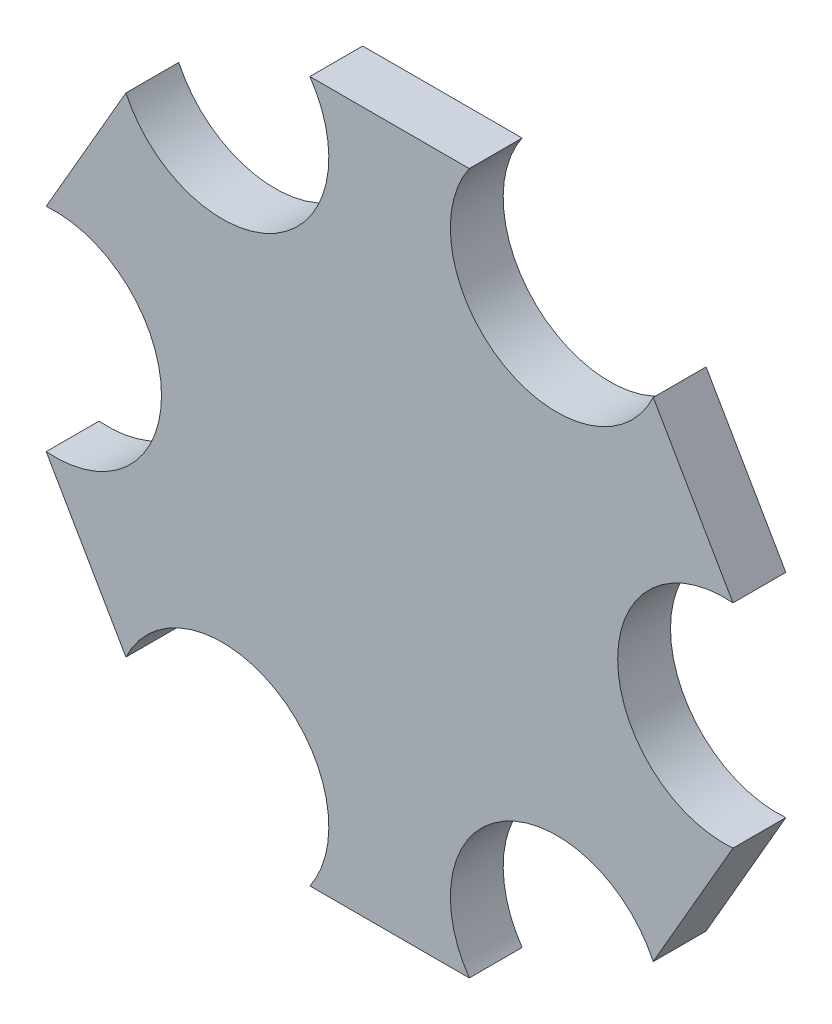
ISO-10303-21;
HEADER;
FILE_DESCRIPTION(('STEP AP214'),'2;1');
FILE_NAME('part.step','',(''),(''),'','','');
FILE_SCHEMA(('AUTOMOTIVE_DESIGN { 1 0 10303 214 1 1 1 1 }'));
ENDSEC;
DATA;
#1=APPLICATION_CONTEXT('core data for automotive mechanical design processes');
#2=APPLICATION_PROTOCOL_DEFINITION('international standard','automotive_design',2000,#1);
#3=PRODUCT_CONTEXT('',#1,'mechanical');
#4=PRODUCT('Part','Part','',(#3));
#5=PRODUCT_RELATED_PRODUCT_CATEGORY('part','',(#4));
#6=PRODUCT_DEFINITION_FORMATION('','',#4);
#7=PRODUCT_DEFINITION_CONTEXT('part definition',#1,'design');
#8=PRODUCT_DEFINITION('design','',#6,#7);
#9=PRODUCT_DEFINITION_SHAPE('','',#8);
#10=(LENGTH_UNIT() NAMED_UNIT(*) SI_UNIT(.MILLI.,.METRE.));
#11=(NAMED_UNIT(*) PLANE_ANGLE_UNIT() SI_UNIT($,.RADIAN.));
#12=(NAMED_UNIT(*) SI_UNIT($,.STERADIAN.) SOLID_ANGLE_UNIT());
#13=UNCERTAINTY_MEASURE_WITH_UNIT(LENGTH_MEASURE(1.E-05),#10,'distance_accuracy_value','');
#14=(GEOMETRIC_REPRESENTATION_CONTEXT(3) GLOBAL_UNCERTAINTY_ASSIGNED_CONTEXT((#13)) GLOBAL_UNIT_ASSIGNED_CONTEXT((#10,
#11,#12)) REPRESENTATION_CONTEXT('',''));
#15=CARTESIAN_POINT('',(0.,0.,0.));
#16=DIRECTION('',(0.,0.,1.));
#17=DIRECTION('',(1.,0.,0.));
#18=AXIS2_PLACEMENT_3D('',#15,#16,#17);
#19=CARTESIAN_POINT('',(11.4892703568736,0.,1.5));
#20=DIRECTION('',(-0.866025403784438,-0.500000000000001,0.));
#21=DIRECTION('',(0.500000000000001,-0.866025403784438,0.));
#22=AXIS2_PLACEMENT_3D('',#19,#20,#21);
#23=PLANE('',#22);
#24=DIRECTION('',(-0.500000000000001,0.866025403784438,0.));
#25=VECTOR('',#24,1.);
#26=CARTESIAN_POINT('',(11.4892703568736,0.,0.));
#27=LINE('',#26,#25);
#28=CARTESIAN_POINT('',(9.74865291135112,3.01483785218562,0.));
#29=VERTEX_POINT('',#28);
#30=CARTESIAN_POINT('',(7.48525262395928,6.93516214781426,0.));
#31=VERTEX_POINT('',#30);
#32=EDGE_CURVE('E245',#29,#31,#27,.T.);
#33=ORIENTED_EDGE('',*,*,#32,.T.);
#34=DIRECTION('',(0.,0.,1.));
#35=VECTOR('',#34,1.);
#36=CARTESIAN_POINT('',(7.48525262395928,6.93516214781426,0.));
#37=LINE('',#36,#35);
#38=CARTESIAN_POINT('',(7.48525262395928,6.93516214781426,1.5));
#39=VERTEX_POINT('',#38);
#40=EDGE_CURVE('E238',#31,#39,#37,.T.);
#41=ORIENTED_EDGE('',*,*,#40,.T.);
#42=DIRECTION('',(-0.500000000000001,0.866025403784438,0.));
#43=VECTOR('',#42,1.);
#44=CARTESIAN_POINT('',(11.4892703568736,0.,1.5));
#45=LINE('',#44,#43);
#46=CARTESIAN_POINT('',(9.74865291135112,3.01483785218562,1.5));
#47=VERTEX_POINT('',#46);
#48=EDGE_CURVE('E168',#47,#39,#45,.T.);
#49=ORIENTED_EDGE('',*,*,#48,.F.);
#50=DIRECTION('',(0.,0.,1.));
#51=VECTOR('',#50,1.);
#52=CARTESIAN_POINT('',(9.74865291135112,3.01483785218562,0.));
#53=LINE('',#52,#51);
#54=EDGE_CURVE('E232',#47,#29,#53,.F.);
#55=ORIENTED_EDGE('',*,*,#54,.T.);
#56=EDGE_LOOP('',(#33,#41,#49,#55));
#57=FACE_BOUND('',#56,.T.);
#58=ADVANCED_FACE('F46',(#57),#23,.F.);
#59=CARTESIAN_POINT('',(5.74463517843677,9.95,1.5));
#60=DIRECTION('',(0.,-1.,0.));
#61=DIRECTION('',(1.,0.,0.));
#62=AXIS2_PLACEMENT_3D('',#59,#60,#61);
#63=PLANE('',#62);
#64=DIRECTION('',(-1.,0.,0.));
#65=VECTOR('',#64,1.);
#66=CARTESIAN_POINT('',(5.74463517843677,9.95,0.));
#67=LINE('',#66,#65);
#68=CARTESIAN_POINT('',(2.26340028739187,9.95,0.));
#69=VERTEX_POINT('',#68);
#70=CARTESIAN_POINT('',(-2.26340028739178,9.94999999999999,0.));
#71=VERTEX_POINT('',#70);
#72=EDGE_CURVE('E163',#69,#71,#67,.T.);
#73=ORIENTED_EDGE('',*,*,#72,.T.);
#74=DIRECTION('',(0.,0.,1.));
#75=VECTOR('',#74,1.);
#76=CARTESIAN_POINT('',(-2.26340028739178,9.94999999999999,0.));
#77=LINE('',#76,#75);
#78=CARTESIAN_POINT('',(-2.26340028739178,9.94999999999999,1.5));
#79=VERTEX_POINT('',#78);
#80=EDGE_CURVE('E61',#71,#79,#77,.T.);
#81=ORIENTED_EDGE('',*,*,#80,.T.);
#82=DIRECTION('',(-1.,0.,0.));
#83=VECTOR('',#82,1.);
#84=CARTESIAN_POINT('',(5.74463517843677,9.95,1.5));
#85=LINE('',#84,#83);
#86=CARTESIAN_POINT('',(2.26340028739187,9.95,1.5));
#87=VERTEX_POINT('',#86);
#88=EDGE_CURVE('E248',#87,#79,#85,.T.);
#89=ORIENTED_EDGE('',*,*,#88,.F.);
#90=DIRECTION('',(0.,0.,1.));
#91=VECTOR('',#90,1.);
#92=CARTESIAN_POINT('',(2.26340028739187,9.95,0.));
#93=LINE('',#92,#91);
#94=EDGE_CURVE('E235',#87,#69,#93,.F.);
#95=ORIENTED_EDGE('',*,*,#94,.T.);
#96=EDGE_LOOP('',(#73,#81,#89,#95));
#97=FACE_BOUND('',#96,.T.);
#98=ADVANCED_FACE('F264',(#97),#63,.F.);
#99=CARTESIAN_POINT('',(-5.74463517843683,9.94999999999998,1.5));
#100=DIRECTION('',(0.866025403784442,-0.499999999999995,0.));
#101=DIRECTION('',(0.499999999999995,0.866025403784442,0.));
#102=AXIS2_PLACEMENT_3D('',#99,#100,#101);
#103=PLANE('',#102);
#104=DIRECTION('',(-0.499999999999995,-0.866025403784441,0.));
#105=VECTOR('',#104,1.);
#106=CARTESIAN_POINT('',(-5.74463517843683,9.94999999999998,1.5));
#107=LINE('',#106,#105);
#108=CARTESIAN_POINT('',(-7.48525262395925,6.93516214781435,1.5));
#109=VERTEX_POINT('',#108);
#110=CARTESIAN_POINT('',(-9.74865291135106,3.01483785218569,1.5));
#111=VERTEX_POINT('',#110);
#112=EDGE_CURVE('E251',#109,#111,#107,.T.);
#113=ORIENTED_EDGE('',*,*,#112,.F.);
#114=DIRECTION('',(0.,0.,1.));
#115=VECTOR('',#114,1.);
#116=CARTESIAN_POINT('',(-7.48525262395925,6.93516214781435,0.));
#117=LINE('',#116,#115);
#118=CARTESIAN_POINT('',(-7.48525262395925,6.93516214781435,0.));
#119=VERTEX_POINT('',#118);
#120=EDGE_CURVE('E241',#109,#119,#117,.F.);
#121=ORIENTED_EDGE('',*,*,#120,.T.);
#122=DIRECTION('',(-0.499999999999995,-0.866025403784441,0.));
#123=VECTOR('',#122,1.);
#124=CARTESIAN_POINT('',(-5.74463517843683,9.94999999999998,0.));
#125=LINE('',#124,#123);
#126=CARTESIAN_POINT('',(-9.74865291135106,3.01483785218569,0.));
#127=VERTEX_POINT('',#126);
#128=EDGE_CURVE('E158',#119,#127,#125,.T.);
#129=ORIENTED_EDGE('',*,*,#128,.T.);
#130=DIRECTION('',(0.,0.,1.));
#131=VECTOR('',#130,1.);
#132=CARTESIAN_POINT('',(-9.74865291135106,3.01483785218569,0.));
#133=LINE('',#132,#131);
#134=EDGE_CURVE('E69',#127,#111,#133,.T.);
#135=ORIENTED_EDGE('',*,*,#134,.T.);
#136=EDGE_LOOP('',(#113,#121,#129,#135));
#137=FACE_BOUND('',#136,.T.);
#138=ADVANCED_FACE('F271',(#137),#103,.F.);
#139=CARTESIAN_POINT('',(-11.4892703568736,0.,1.5));
#140=DIRECTION('',(0.866025403784434,0.500000000000007,0.));
#141=DIRECTION('',(-0.500000000000007,0.866025403784435,0.));
#142=AXIS2_PLACEMENT_3D('',#139,#140,#141);
#143=PLANE('',#142);
#144=DIRECTION('',(0.500000000000007,-0.866025403784435,0.));
#145=VECTOR('',#144,1.);
#146=CARTESIAN_POINT('',(-11.4892703568736,0.,0.));
#147=LINE('',#146,#145);
#148=CARTESIAN_POINT('',(-9.7486529113511,-3.01483785218569,0.));
#149=VERTEX_POINT('',#148);
#150=CARTESIAN_POINT('',(-7.48525262395931,-6.93516214781417,0.));
#151=VERTEX_POINT('',#150);
#152=EDGE_CURVE('E149',#149,#151,#147,.T.);
#153=ORIENTED_EDGE('',*,*,#152,.T.);
#154=DIRECTION('',(0.,0.,1.));
#155=VECTOR('',#154,1.);
#156=CARTESIAN_POINT('',(-7.48525262395931,-6.93516214781418,0.));
#157=LINE('',#156,#155);
#158=CARTESIAN_POINT('',(-7.48525262395931,-6.93516214781417,1.5));
#159=VERTEX_POINT('',#158);
#160=EDGE_CURVE('E221',#151,#159,#157,.T.);
#161=ORIENTED_EDGE('',*,*,#160,.T.);
#162=DIRECTION('',(0.500000000000007,-0.866025403784435,0.));
#163=VECTOR('',#162,1.);
#164=CARTESIAN_POINT('',(-11.4892703568736,0.,1.5));
#165=LINE('',#164,#163);
#166=CARTESIAN_POINT('',(-9.7486529113511,-3.01483785218569,1.5));
#167=VERTEX_POINT('',#166);
#168=EDGE_CURVE('E151',#167,#159,#165,.T.);
#169=ORIENTED_EDGE('',*,*,#168,.F.);
#170=DIRECTION('',(0.,0.,1.));
#171=VECTOR('',#170,1.);
#172=CARTESIAN_POINT('',(-9.7486529113511,-3.01483785218569,0.));
#173=LINE('',#172,#171);
#174=EDGE_CURVE('E135',#167,#149,#173,.F.);
#175=ORIENTED_EDGE('',*,*,#174,.T.);
#176=EDGE_LOOP('',(#153,#161,#169,#175));
#177=FACE_BOUND('',#176,.T.);
#178=ADVANCED_FACE('F147',(#177),#143,.F.);
#179=CARTESIAN_POINT('',(-5.74463517843669,-9.95000000000006,1.5));
#180=DIRECTION('',(0.,1.,0.));
#181=DIRECTION('',(-1.,0.,0.));
#182=AXIS2_PLACEMENT_3D('',#179,#180,#181);
#183=PLANE('',#182);
#184=DIRECTION('',(1.,0.,0.));
#185=VECTOR('',#184,1.);
#186=CARTESIAN_POINT('',(-5.74463517843669,-9.95000000000006,0.));
#187=LINE('',#186,#185);
#188=CARTESIAN_POINT('',(-2.26340028739197,-9.95000000000002,0.));
#189=VERTEX_POINT('',#188);
#190=CARTESIAN_POINT('',(2.26340028739169,-9.94999999999998,0.));
#191=VERTEX_POINT('',#190);
#192=EDGE_CURVE('E157',#189,#191,#187,.T.);
#193=ORIENTED_EDGE('',*,*,#192,.T.);
#194=DIRECTION('',(0.,0.,1.));
#195=VECTOR('',#194,1.);
#196=CARTESIAN_POINT('',(2.26340028739169,-9.94999999999998,0.));
#197=LINE('',#196,#195);
#198=CARTESIAN_POINT('',(2.26340028739169,-9.94999999999998,1.5));
#199=VERTEX_POINT('',#198);
#200=EDGE_CURVE('E226',#191,#199,#197,.T.);
#201=ORIENTED_EDGE('',*,*,#200,.T.);
#202=DIRECTION('',(1.,0.,0.));
#203=VECTOR('',#202,1.);
#204=CARTESIAN_POINT('',(-5.74463517843669,-9.95000000000006,1.5));
#205=LINE('',#204,#203);
#206=CARTESIAN_POINT('',(-2.26340028739197,-9.95000000000002,1.5));
#207=VERTEX_POINT('',#206);
#208=EDGE_CURVE('E255',#207,#199,#205,.T.);
#209=ORIENTED_EDGE('',*,*,#208,.F.);
#210=DIRECTION('',(0.,0.,1.));
#211=VECTOR('',#210,1.);
#212=CARTESIAN_POINT('',(-2.26340028739197,-9.95000000000002,0.));
#213=LINE('',#212,#211);
#214=EDGE_CURVE('E218',#207,#189,#213,.F.);
#215=ORIENTED_EDGE('',*,*,#214,.T.);
#216=EDGE_LOOP('',(#193,#201,#209,#215));
#217=FACE_BOUND('',#216,.T.);
#218=ADVANCED_FACE('F291',(#217),#183,.F.);
#219=CARTESIAN_POINT('',(5.7446351784369,-9.94999999999994,1.5));
#220=DIRECTION('',(-0.866025403784441,0.499999999999995,0.));
#221=DIRECTION('',(-0.499999999999995,-0.866025403784441,0.));
#222=AXIS2_PLACEMENT_3D('',#219,#220,#221);
#223=PLANE('',#222);
#224=DIRECTION('',(0.499999999999995,0.866025403784441,0.));
#225=VECTOR('',#224,1.);
#226=CARTESIAN_POINT('',(5.7446351784369,-9.94999999999994,0.));
#227=LINE('',#226,#225);
#228=CARTESIAN_POINT('',(7.48525262395923,-6.93516214781446,0.));
#229=VERTEX_POINT('',#228);
#230=CARTESIAN_POINT('',(9.74865291135107,-3.01483785218575,0.));
#231=VERTEX_POINT('',#230);
#232=EDGE_CURVE('E161',#229,#231,#227,.T.);
#233=ORIENTED_EDGE('',*,*,#232,.T.);
#234=DIRECTION('',(0.,0.,1.));
#235=VECTOR('',#234,1.);
#236=CARTESIAN_POINT('',(9.74865291135107,-3.01483785218575,0.));
#237=LINE('',#236,#235);
#238=CARTESIAN_POINT('',(9.74865291135107,-3.01483785218575,1.5));
#239=VERTEX_POINT('',#238);
#240=EDGE_CURVE('E229',#231,#239,#237,.T.);
#241=ORIENTED_EDGE('',*,*,#240,.T.);
#242=DIRECTION('',(0.499999999999995,0.866025403784441,0.));
#243=VECTOR('',#242,1.);
#244=CARTESIAN_POINT('',(5.7446351784369,-9.94999999999994,1.5));
#245=LINE('',#244,#243);
#246=CARTESIAN_POINT('',(7.48525262395923,-6.93516214781446,1.5));
#247=VERTEX_POINT('',#246);
#248=EDGE_CURVE('E142',#247,#239,#245,.T.);
#249=ORIENTED_EDGE('',*,*,#248,.F.);
#250=DIRECTION('',(0.,0.,1.));
#251=VECTOR('',#250,1.);
#252=CARTESIAN_POINT('',(7.48525262395923,-6.93516214781446,0.));
#253=LINE('',#252,#251);
#254=EDGE_CURVE('E223',#247,#229,#253,.F.);
#255=ORIENTED_EDGE('',*,*,#254,.T.);
#256=EDGE_LOOP('',(#233,#241,#249,#255));
#257=FACE_BOUND('',#256,.T.);
#258=ADVANCED_FACE('F283',(#257),#223,.F.);
#259=CARTESIAN_POINT('',(0.,0.,1.5));
#260=DIRECTION('',(0.,0.,1.));
#261=DIRECTION('',(1.,0.,0.));
#262=AXIS2_PLACEMENT_3D('',#259,#260,#261);
#263=PLANE('',#262);
#264=CARTESIAN_POINT('',(-4.74999999999998,8.22724133595218,1.5));
#265=DIRECTION('',(0.,0.,1.));
#266=DIRECTION('',(1.,0.,0.));
#267=AXIS2_PLACEMENT_3D('',#264,#265,#266);
#268=CIRCLE('',#267,3.02507446938005);
#269=EDGE_CURVE('E200',#109,#79,#268,.T.);
#270=ORIENTED_EDGE('',*,*,#269,.F.);
#271=ORIENTED_EDGE('',*,*,#112,.T.);
#272=CARTESIAN_POINT('',(-9.5,0.,1.5));
#273=DIRECTION('',(0.,0.,1.));
#274=DIRECTION('',(1.,0.,0.));
#275=AXIS2_PLACEMENT_3D('',#272,#273,#274);
#276=CIRCLE('',#275,3.02507446938005);
#277=EDGE_CURVE('E152',#167,#111,#276,.T.);
#278=ORIENTED_EDGE('',*,*,#277,.F.);
#279=ORIENTED_EDGE('',*,*,#168,.T.);
#280=CARTESIAN_POINT('',(-4.7500000000001,-8.22724133595211,1.5));
#281=DIRECTION('',(0.,0.,1.));
#282=DIRECTION('',(1.,0.,0.));
#283=AXIS2_PLACEMENT_3D('',#280,#281,#282);
#284=CIRCLE('',#283,3.02507446938005);
#285=EDGE_CURVE('E192',#207,#159,#284,.T.);
#286=ORIENTED_EDGE('',*,*,#285,.F.);
#287=ORIENTED_EDGE('',*,*,#208,.T.);
#288=CARTESIAN_POINT('',(4.74999999999992,-8.22724133595221,1.5));
#289=DIRECTION('',(0.,0.,1.));
#290=DIRECTION('',(1.,0.,0.));
#291=AXIS2_PLACEMENT_3D('',#288,#289,#290);
#292=CIRCLE('',#291,3.02507446938005);
#293=EDGE_CURVE('E212',#247,#199,#292,.T.);
#294=ORIENTED_EDGE('',*,*,#293,.F.);
#295=ORIENTED_EDGE('',*,*,#248,.T.);
#296=CARTESIAN_POINT('',(9.5,0.,1.5));
#297=DIRECTION('',(0.,0.,1.));
#298=DIRECTION('',(1.,0.,0.));
#299=AXIS2_PLACEMENT_3D('',#296,#297,#298);
#300=CIRCLE('',#299,3.02507446938005);
#301=EDGE_CURVE('E207',#47,#239,#300,.T.);
#302=ORIENTED_EDGE('',*,*,#301,.F.);
#303=ORIENTED_EDGE('',*,*,#48,.T.);
#304=CARTESIAN_POINT('',(4.75000000000004,8.22724133595215,1.5));
#305=DIRECTION('',(0.,0.,1.));
#306=DIRECTION('',(1.,0.,0.));
#307=AXIS2_PLACEMENT_3D('',#304,#305,#306);
#308=CIRCLE('',#307,3.02507446938005);
#309=EDGE_CURVE('E202',#87,#39,#308,.T.);
#310=ORIENTED_EDGE('',*,*,#309,.F.);
#311=ORIENTED_EDGE('',*,*,#88,.T.);
#312=EDGE_LOOP('',(#270,#271,#278,#279,#286,#287,#294,#295,#302,#303,#310,#311));
#313=FACE_BOUND('',#312,.T.);
#314=ADVANCED_FACE('F273',(#313),#263,.T.);
#315=CARTESIAN_POINT('',(0.,0.,0.));
#316=DIRECTION('',(0.,0.,1.));
#317=DIRECTION('',(1.,0.,0.));
#318=AXIS2_PLACEMENT_3D('',#315,#316,#317);
#319=PLANE('',#318);
#320=CARTESIAN_POINT('',(0.,0.,0.));
#321=DIRECTION('',(0.,0.,1.));
#322=DIRECTION('',(0.,-1.,0.));
#323=AXIS2_PLACEMENT_3D('',#320,#321,#322);
#324=CIRCLE('',#323,3.62);
#325=CARTESIAN_POINT('',(0.,-3.62,0.));
#326=VERTEX_POINT('',#325);
#327=EDGE_CURVE('E193',#326,#326,#324,.T.);
#328=ORIENTED_EDGE('',*,*,#327,.T.);
#329=EDGE_LOOP('',(#328));
#330=FACE_BOUND('',#329,.T.);
#331=ORIENTED_EDGE('',*,*,#128,.F.);
#332=CARTESIAN_POINT('',(-4.74999999999998,8.22724133595218,0.));
#333=DIRECTION('',(0.,0.,1.));
#334=DIRECTION('',(1.,0.,0.));
#335=AXIS2_PLACEMENT_3D('',#332,#333,#334);
#336=CIRCLE('',#335,3.02507446938005);
#337=EDGE_CURVE('E171',#119,#71,#336,.T.);
#338=ORIENTED_EDGE('',*,*,#337,.T.);
#339=ORIENTED_EDGE('',*,*,#72,.F.);
#340=CARTESIAN_POINT('',(4.75000000000004,8.22724133595215,0.));
#341=DIRECTION('',(0.,0.,1.));
#342=DIRECTION('',(1.,0.,0.));
#343=AXIS2_PLACEMENT_3D('',#340,#341,#342);
#344=CIRCLE('',#343,3.02507446938005);
#345=EDGE_CURVE('E204',#69,#31,#344,.T.);
#346=ORIENTED_EDGE('',*,*,#345,.T.);
#347=ORIENTED_EDGE('',*,*,#32,.F.);
#348=CARTESIAN_POINT('',(9.5,0.,0.));
#349=DIRECTION('',(0.,0.,1.));
#350=DIRECTION('',(1.,0.,0.));
#351=AXIS2_PLACEMENT_3D('',#348,#349,#350);
#352=CIRCLE('',#351,3.02507446938005);
#353=EDGE_CURVE('E209',#29,#231,#352,.T.);
#354=ORIENTED_EDGE('',*,*,#353,.T.);
#355=ORIENTED_EDGE('',*,*,#232,.F.);
#356=CARTESIAN_POINT('',(4.74999999999992,-8.22724133595221,0.));
#357=DIRECTION('',(0.,0.,1.));
#358=DIRECTION('',(1.,0.,0.));
#359=AXIS2_PLACEMENT_3D('',#356,#357,#358);
#360=CIRCLE('',#359,3.02507446938005);
#361=EDGE_CURVE('E195',#229,#191,#360,.T.);
#362=ORIENTED_EDGE('',*,*,#361,.T.);
#363=ORIENTED_EDGE('',*,*,#192,.F.);
#364=CARTESIAN_POINT('',(-4.7500000000001,-8.22724133595211,0.));
#365=DIRECTION('',(0.,0.,1.));
#366=DIRECTION('',(1.,0.,0.));
#367=AXIS2_PLACEMENT_3D('',#364,#365,#366);
#368=CIRCLE('',#367,3.02507446938005);
#369=EDGE_CURVE('E141',#189,#151,#368,.T.);
#370=ORIENTED_EDGE('',*,*,#369,.T.);
#371=ORIENTED_EDGE('',*,*,#152,.F.);
#372=CARTESIAN_POINT('',(-9.5,0.,0.));
#373=DIRECTION('',(0.,0.,1.));
#374=DIRECTION('',(1.,0.,0.));
#375=AXIS2_PLACEMENT_3D('',#372,#373,#374);
#376=CIRCLE('',#375,3.02507446938005);
#377=EDGE_CURVE('E132',#149,#127,#376,.T.);
#378=ORIENTED_EDGE('',*,*,#377,.T.);
#379=EDGE_LOOP('',(#331,#338,#339,#346,#347,#354,#355,#362,#363,#370,#371,#378));
#380=FACE_BOUND('',#379,.T.);
#381=ADVANCED_FACE('F155',(#330,#380),#319,.F.);
#382=CARTESIAN_POINT('',(-9.5,0.,0.));
#383=DIRECTION('',(0.,0.,1.));
#384=DIRECTION('',(1.,0.,0.));
#385=AXIS2_PLACEMENT_3D('',#382,#383,#384);
#386=CYLINDRICAL_SURFACE('',#385,3.02507446938005);
#387=ORIENTED_EDGE('',*,*,#377,.F.);
#388=ORIENTED_EDGE('',*,*,#174,.F.);
#389=ORIENTED_EDGE('',*,*,#277,.T.);
#390=ORIENTED_EDGE('',*,*,#134,.F.);
#391=EDGE_LOOP('',(#387,#388,#389,#390));
#392=FACE_BOUND('',#391,.T.);
#393=ADVANCED_FACE('F134',(#392),#386,.F.);
#394=CARTESIAN_POINT('',(-4.7500000000001,-8.22724133595211,0.));
#395=DIRECTION('',(0.,0.,1.));
#396=DIRECTION('',(1.,0.,0.));
#397=AXIS2_PLACEMENT_3D('',#394,#395,#396);
#398=CYLINDRICAL_SURFACE('',#397,3.02507446938005);
#399=ORIENTED_EDGE('',*,*,#369,.F.);
#400=ORIENTED_EDGE('',*,*,#214,.F.);
#401=ORIENTED_EDGE('',*,*,#285,.T.);
#402=ORIENTED_EDGE('',*,*,#160,.F.);
#403=EDGE_LOOP('',(#399,#400,#401,#402));
#404=FACE_BOUND('',#403,.T.);
#405=ADVANCED_FACE('F293',(#404),#398,.F.);
#406=CARTESIAN_POINT('',(4.74999999999992,-8.22724133595221,0.));
#407=DIRECTION('',(0.,0.,1.));
#408=DIRECTION('',(1.,0.,0.));
#409=AXIS2_PLACEMENT_3D('',#406,#407,#408);
#410=CYLINDRICAL_SURFACE('',#409,3.02507446938005);
#411=ORIENTED_EDGE('',*,*,#361,.F.);
#412=ORIENTED_EDGE('',*,*,#254,.F.);
#413=ORIENTED_EDGE('',*,*,#293,.T.);
#414=ORIENTED_EDGE('',*,*,#200,.F.);
#415=EDGE_LOOP('',(#411,#412,#413,#414));
#416=FACE_BOUND('',#415,.T.);
#417=ADVANCED_FACE('F287',(#416),#410,.F.);
#418=CARTESIAN_POINT('',(9.5,0.,0.));
#419=DIRECTION('',(0.,0.,1.));
#420=DIRECTION('',(1.,0.,0.));
#421=AXIS2_PLACEMENT_3D('',#418,#419,#420);
#422=CYLINDRICAL_SURFACE('',#421,3.02507446938005);
#423=ORIENTED_EDGE('',*,*,#301,.T.);
#424=ORIENTED_EDGE('',*,*,#240,.F.);
#425=ORIENTED_EDGE('',*,*,#353,.F.);
#426=ORIENTED_EDGE('',*,*,#54,.F.);
#427=EDGE_LOOP('',(#423,#424,#425,#426));
#428=FACE_BOUND('',#427,.T.);
#429=ADVANCED_FACE('F300',(#428),#422,.F.);
#430=CARTESIAN_POINT('',(4.75000000000004,8.22724133595215,0.));
#431=DIRECTION('',(0.,0.,1.));
#432=DIRECTION('',(1.,0.,0.));
#433=AXIS2_PLACEMENT_3D('',#430,#431,#432);
#434=CYLINDRICAL_SURFACE('',#433,3.02507446938005);
#435=ORIENTED_EDGE('',*,*,#345,.F.);
#436=ORIENTED_EDGE('',*,*,#94,.F.);
#437=ORIENTED_EDGE('',*,*,#309,.T.);
#438=ORIENTED_EDGE('',*,*,#40,.F.);
#439=EDGE_LOOP('',(#435,#436,#437,#438));
#440=FACE_BOUND('',#439,.T.);
#441=ADVANCED_FACE('F278',(#440),#434,.F.);
#442=CARTESIAN_POINT('',(-4.74999999999998,8.22724133595218,0.));
#443=DIRECTION('',(0.,0.,1.));
#444=DIRECTION('',(1.,0.,0.));
#445=AXIS2_PLACEMENT_3D('',#442,#443,#444);
#446=CYLINDRICAL_SURFACE('',#445,3.02507446938005);
#447=ORIENTED_EDGE('',*,*,#337,.F.);
#448=ORIENTED_EDGE('',*,*,#120,.F.);
#449=ORIENTED_EDGE('',*,*,#269,.T.);
#450=ORIENTED_EDGE('',*,*,#80,.F.);
#451=EDGE_LOOP('',(#447,#448,#449,#450));
#452=FACE_BOUND('',#451,.T.);
#453=ADVANCED_FACE('F267',(#452),#446,.F.);
#454=CARTESIAN_POINT('',(0.,0.,0.));
#455=DIRECTION('',(0.,0.,1.));
#456=DIRECTION('',(0.,1.,0.));
#457=AXIS2_PLACEMENT_3D('',#454,#455,#456);
#458=SPHERICAL_SURFACE('',#457,3.62);
#459=ORIENTED_EDGE('',*,*,#327,.F.);
#460=EDGE_LOOP('',(#459));
#461=FACE_BOUND('',#460,.T.);
#462=ADVANCED_FACE('F327',(#461),#458,.T.);
#463=CLOSED_SHELL('',(#58,#98,#138,#178,#218,#258,#314,#381,#393,#405,#417,#429,#441,#453,#462));
#464=CARTESIAN_POINT('',(0.,0.,0.));
#465=DIRECTION('',(0.,0.,1.));
#466=DIRECTION('',(0.,-1.,0.));
#467=AXIS2_PLACEMENT_3D('',#464,#465,#466);
#468=CYLINDRICAL_SURFACE('',#467,0.1);
#469=CARTESIAN_POINT('',(0.,0.,0.));
#470=DIRECTION('',(0.,0.,1.));
#471=DIRECTION('',(1.,0.,0.));
#472=AXIS2_PLACEMENT_3D('',#469,#470,#471);
#473=CIRCLE('',#472,0.1);
#474=CARTESIAN_POINT('',(0.1,0.,0.));
#475=VERTEX_POINT('',#474);
#476=EDGE_CURVE('E11',#475,#475,#473,.F.);
#477=ORIENTED_EDGE('',*,*,#476,.T.);
#478=EDGE_LOOP('',(#477));
#479=FACE_BOUND('',#478,.T.);
#480=CARTESIAN_POINT('',(0.,0.,-3.51857925873498));
#481=DIRECTION('',(0.,0.,1.));
#482=DIRECTION('',(0.,-1.,0.));
#483=AXIS2_PLACEMENT_3D('',#480,#481,#482);
#484=CIRCLE('',#483,0.1);
#485=CARTESIAN_POINT('',(0.,-0.1,-3.51857925873498));
#486=VERTEX_POINT('',#485);
#487=EDGE_CURVE('E190',#486,#486,#484,.T.);
#488=ORIENTED_EDGE('',*,*,#487,.T.);
#489=EDGE_LOOP('',(#488));
#490=FACE_BOUND('',#489,.T.);
#491=ADVANCED_FACE('F184',(#479,#490),#468,.T.);
#492=CARTESIAN_POINT('',(0.,0.,0.));
#493=DIRECTION('',(0.,0.,1.));
#494=DIRECTION('',(0.,1.,0.));
#495=AXIS2_PLACEMENT_3D('',#492,#493,#494);
#496=SPHERICAL_SURFACE('',#495,3.52);
#497=ORIENTED_EDGE('',*,*,#487,.F.);
#498=EDGE_LOOP('',(#497));
#499=FACE_BOUND('',#498,.T.);
#500=CARTESIAN_POINT('',(0.,0.,0.));
#501=DIRECTION('',(0.,0.,1.));
#502=DIRECTION('',(1.,0.,0.));
#503=AXIS2_PLACEMENT_3D('',#500,#501,#502);
#504=CIRCLE('',#503,3.52);
#505=CARTESIAN_POINT('',(3.52,0.,0.));
#506=VERTEX_POINT('',#505);
#507=EDGE_CURVE('E54',#506,#506,#504,.T.);
#508=ORIENTED_EDGE('',*,*,#507,.T.);
#509=EDGE_LOOP('',(#508));
#510=FACE_BOUND('',#509,.T.);
#511=ADVANCED_FACE('F175',(#499,#510),#496,.F.);
#512=ORIENTED_EDGE('',*,*,#507,.F.);
#513=EDGE_LOOP('',(#512));
#514=FACE_BOUND('',#513,.T.);
#515=ORIENTED_EDGE('',*,*,#476,.F.);
#516=EDGE_LOOP('',(#515));
#517=FACE_BOUND('',#516,.T.);
#518=ADVANCED_FACE('F177',(#514,#517),#319,.F.);
#519=CLOSED_SHELL('',(#491,#511,#518));
#520=ORIENTED_CLOSED_SHELL('',*,#519,.T.);
#521=BREP_WITH_VOIDS('B2',#463,(#520));
#522=ADVANCED_BREP_SHAPE_REPRESENTATION('',(#18,#521),#14);
#523=SHAPE_DEFINITION_REPRESENTATION(#9,#522);
ENDSEC;
END-ISO-10303-21;
